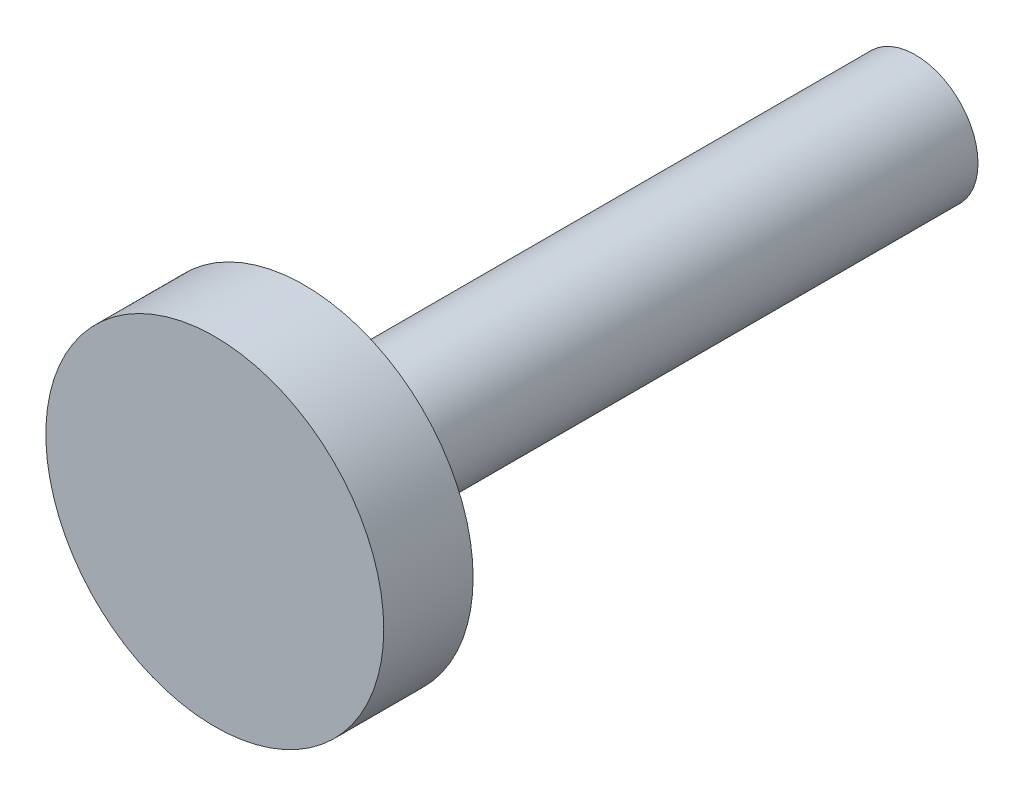
ISO-10303-21;
HEADER;
FILE_DESCRIPTION(('STEP AP214'),'2;1');
FILE_NAME('part.step','',(''),(''),'','','');
FILE_SCHEMA(('AUTOMOTIVE_DESIGN { 1 0 10303 214 1 1 1 1 }'));
ENDSEC;
DATA;
#1=APPLICATION_CONTEXT('core data for automotive mechanical design processes');
#2=APPLICATION_PROTOCOL_DEFINITION('international standard','automotive_design',2000,#1);
#3=PRODUCT_CONTEXT('',#1,'mechanical');
#4=PRODUCT('Part','Part','',(#3));
#5=PRODUCT_RELATED_PRODUCT_CATEGORY('part','',(#4));
#6=PRODUCT_DEFINITION_FORMATION('','',#4);
#7=PRODUCT_DEFINITION_CONTEXT('part definition',#1,'design');
#8=PRODUCT_DEFINITION('design','',#6,#7);
#9=PRODUCT_DEFINITION_SHAPE('','',#8);
#10=(LENGTH_UNIT() NAMED_UNIT(*) SI_UNIT(.MILLI.,.METRE.));
#11=(NAMED_UNIT(*) PLANE_ANGLE_UNIT() SI_UNIT($,.RADIAN.));
#12=(NAMED_UNIT(*) SI_UNIT($,.STERADIAN.) SOLID_ANGLE_UNIT());
#13=UNCERTAINTY_MEASURE_WITH_UNIT(LENGTH_MEASURE(1.E-05),#10,'distance_accuracy_value','');
#14=(GEOMETRIC_REPRESENTATION_CONTEXT(3) GLOBAL_UNCERTAINTY_ASSIGNED_CONTEXT((#13)) GLOBAL_UNIT_ASSIGNED_CONTEXT((#10,
#11,#12)) REPRESENTATION_CONTEXT('',''));
#15=CARTESIAN_POINT('',(0.,0.,0.));
#16=DIRECTION('',(0.,0.,1.));
#17=DIRECTION('',(1.,0.,0.));
#18=AXIS2_PLACEMENT_3D('',#15,#16,#17);
#19=CARTESIAN_POINT('',(0.,0.,34.2));
#20=DIRECTION('',(0.,0.,-1.));
#21=DIRECTION('',(-1.,0.,0.));
#22=AXIS2_PLACEMENT_3D('',#19,#20,#21);
#23=CYLINDRICAL_SURFACE('',#22,3.5);
#24=CARTESIAN_POINT('',(0.,0.,34.2));
#25=DIRECTION('',(0.,0.,1.));
#26=DIRECTION('',(1.,0.,0.));
#27=AXIS2_PLACEMENT_3D('',#24,#25,#26);
#28=CIRCLE('',#27,3.5);
#29=CARTESIAN_POINT('',(3.5,0.,34.2));
#30=VERTEX_POINT('',#29);
#31=EDGE_CURVE('E11',#30,#30,#28,.T.);
#32=ORIENTED_EDGE('',*,*,#31,.F.);
#33=EDGE_LOOP('',(#32));
#34=FACE_BOUND('',#33,.T.);
#35=CARTESIAN_POINT('',(0.,0.,0.));
#36=DIRECTION('',(0.,0.,1.));
#37=DIRECTION('',(1.,0.,0.));
#38=AXIS2_PLACEMENT_3D('',#35,#36,#37);
#39=CIRCLE('',#38,3.5);
#40=CARTESIAN_POINT('',(3.5,0.,0.));
#41=VERTEX_POINT('',#40);
#42=EDGE_CURVE('E36',#41,#41,#39,.T.);
#43=ORIENTED_EDGE('',*,*,#42,.T.);
#44=EDGE_LOOP('',(#43));
#45=FACE_BOUND('',#44,.T.);
#46=ADVANCED_FACE('F33',(#34,#45),#23,.T.);
#47=CARTESIAN_POINT('',(0.,0.,0.));
#48=DIRECTION('',(0.,0.,1.));
#49=DIRECTION('',(1.,0.,0.));
#50=AXIS2_PLACEMENT_3D('',#47,#48,#49);
#51=PLANE('',#50);
#52=DIRECTION('',(0.156092251279794,-0.98774248116116,0.));
#53=VECTOR('',#52,1.);
#54=CARTESIAN_POINT('',(1.94340988860685,1.57262773880696,0.));
#55=LINE('',#54,#53);
#56=CARTESIAN_POINT('',(1.94340988860685,1.57262773880696,0.));
#57=VERTEX_POINT('',#56);
#58=CARTESIAN_POINT('',(2.33364051680634,-0.896728464095936,0.));
#59=VERTEX_POINT('',#58);
#60=EDGE_CURVE('E121',#57,#59,#55,.T.);
#61=ORIENTED_EDGE('',*,*,#60,.F.);
#62=DIRECTION('',(0.933456206722534,-0.358691385638374,0.));
#63=VECTOR('',#62,1.);
#64=CARTESIAN_POINT('',(-0.390230628199486,2.4693562029029,0.));
#65=LINE('',#64,#63);
#66=CARTESIAN_POINT('',(-0.390230628199486,2.4693562029029,0.));
#67=VERTEX_POINT('',#66);
#68=EDGE_CURVE('E47',#67,#57,#65,.T.);
#69=ORIENTED_EDGE('',*,*,#68,.F.);
#70=DIRECTION('',(0.77736395544274,0.629051095522786,0.));
#71=VECTOR('',#70,1.);
#72=CARTESIAN_POINT('',(-2.33364051680634,0.896728464095936,0.));
#73=LINE('',#72,#71);
#74=CARTESIAN_POINT('',(-2.33364051680634,0.896728464095936,0.));
#75=VERTEX_POINT('',#74);
#76=EDGE_CURVE('E131',#75,#67,#73,.T.);
#77=ORIENTED_EDGE('',*,*,#76,.F.);
#78=DIRECTION('',(-0.156092251279794,0.987742481161161,0.));
#79=VECTOR('',#78,1.);
#80=CARTESIAN_POINT('',(-1.94340988860685,-1.57262773880697,0.));
#81=LINE('',#80,#79);
#82=CARTESIAN_POINT('',(-1.94340988860685,-1.57262773880697,0.));
#83=VERTEX_POINT('',#82);
#84=EDGE_CURVE('E129',#83,#75,#81,.T.);
#85=ORIENTED_EDGE('',*,*,#84,.F.);
#86=DIRECTION('',(-0.933456206722534,0.358691385638374,0.));
#87=VECTOR('',#86,1.);
#88=CARTESIAN_POINT('',(0.390230628199484,-2.4693562029029,0.));
#89=LINE('',#88,#87);
#90=CARTESIAN_POINT('',(0.390230628199484,-2.4693562029029,0.));
#91=VERTEX_POINT('',#90);
#92=EDGE_CURVE('E95',#91,#83,#89,.T.);
#93=ORIENTED_EDGE('',*,*,#92,.F.);
#94=DIRECTION('',(-0.77736395544274,-0.629051095522786,0.));
#95=VECTOR('',#94,1.);
#96=CARTESIAN_POINT('',(2.33364051680634,-0.896728464095936,0.));
#97=LINE('',#96,#95);
#98=EDGE_CURVE('E125',#59,#91,#97,.T.);
#99=ORIENTED_EDGE('',*,*,#98,.F.);
#100=EDGE_LOOP('',(#61,#69,#77,#85,#93,#99));
#101=FACE_BOUND('',#100,.T.);
#102=ORIENTED_EDGE('',*,*,#42,.F.);
#103=EDGE_LOOP('',(#102));
#104=FACE_BOUND('',#103,.T.);
#105=ADVANCED_FACE('F165',(#101,#104),#51,.F.);
#106=CARTESIAN_POINT('',(0.,0.,39.2));
#107=DIRECTION('',(0.,0.,-1.));
#108=DIRECTION('',(-1.,0.,0.));
#109=AXIS2_PLACEMENT_3D('',#106,#107,#108);
#110=CYLINDRICAL_SURFACE('',#109,9.45299319);
#111=CARTESIAN_POINT('',(0.,0.,39.2));
#112=DIRECTION('',(0.,0.,1.));
#113=DIRECTION('',(1.,0.,0.));
#114=AXIS2_PLACEMENT_3D('',#111,#112,#113);
#115=CIRCLE('',#114,9.45299319);
#116=CARTESIAN_POINT('',(9.45299319,0.,39.2));
#117=VERTEX_POINT('',#116);
#118=EDGE_CURVE('E141',#117,#117,#115,.T.);
#119=ORIENTED_EDGE('',*,*,#118,.F.);
#120=EDGE_LOOP('',(#119));
#121=FACE_BOUND('',#120,.T.);
#122=CARTESIAN_POINT('',(0.,0.,34.2));
#123=DIRECTION('',(0.,0.,1.));
#124=DIRECTION('',(1.,0.,0.));
#125=AXIS2_PLACEMENT_3D('',#122,#123,#124);
#126=CIRCLE('',#125,9.45299319);
#127=CARTESIAN_POINT('',(9.45299319,0.,34.2));
#128=VERTEX_POINT('',#127);
#129=EDGE_CURVE('E135',#128,#128,#126,.T.);
#130=ORIENTED_EDGE('',*,*,#129,.T.);
#131=EDGE_LOOP('',(#130));
#132=FACE_BOUND('',#131,.T.);
#133=ADVANCED_FACE('F147',(#121,#132),#110,.T.);
#134=CARTESIAN_POINT('',(0.,0.,39.2));
#135=DIRECTION('',(0.,0.,1.));
#136=DIRECTION('',(1.,0.,0.));
#137=AXIS2_PLACEMENT_3D('',#134,#135,#136);
#138=PLANE('',#137);
#139=ORIENTED_EDGE('',*,*,#118,.T.);
#140=EDGE_LOOP('',(#139));
#141=FACE_BOUND('',#140,.T.);
#142=ADVANCED_FACE('F152',(#141),#138,.T.);
#143=CARTESIAN_POINT('',(0.,0.,34.2));
#144=DIRECTION('',(0.,0.,1.));
#145=DIRECTION('',(1.,0.,0.));
#146=AXIS2_PLACEMENT_3D('',#143,#144,#145);
#147=PLANE('',#146);
#148=ORIENTED_EDGE('',*,*,#31,.T.);
#149=EDGE_LOOP('',(#148));
#150=FACE_BOUND('',#149,.T.);
#151=ORIENTED_EDGE('',*,*,#129,.F.);
#152=EDGE_LOOP('',(#151));
#153=FACE_BOUND('',#152,.T.);
#154=ADVANCED_FACE('F149',(#150,#153),#147,.F.);
#155=CARTESIAN_POINT('',(-0.390230628199486,2.4693562029029,1.92));
#156=DIRECTION('',(0.358691385638374,0.933456206722534,0.));
#157=DIRECTION('',(-0.933456206722534,0.358691385638374,0.));
#158=AXIS2_PLACEMENT_3D('',#155,#156,#157);
#159=PLANE('',#158);
#160=ORIENTED_EDGE('',*,*,#68,.T.);
#161=DIRECTION('',(0.,0.,-1.));
#162=VECTOR('',#161,1.);
#163=CARTESIAN_POINT('',(1.94340988860685,1.57262773880696,1.92));
#164=LINE('',#163,#162);
#165=CARTESIAN_POINT('',(1.94340988860685,1.57262773880696,1.92));
#166=VERTEX_POINT('',#165);
#167=EDGE_CURVE('E77',#166,#57,#164,.T.);
#168=ORIENTED_EDGE('',*,*,#167,.F.);
#169=DIRECTION('',(0.933456206722534,-0.358691385638374,0.));
#170=VECTOR('',#169,1.);
#171=CARTESIAN_POINT('',(-0.390230628199486,2.4693562029029,1.92));
#172=LINE('',#171,#170);
#173=CARTESIAN_POINT('',(-0.390230628199486,2.4693562029029,1.92));
#174=VERTEX_POINT('',#173);
#175=EDGE_CURVE('E133',#174,#166,#172,.T.);
#176=ORIENTED_EDGE('',*,*,#175,.F.);
#177=DIRECTION('',(0.,0.,-1.));
#178=VECTOR('',#177,1.);
#179=CARTESIAN_POINT('',(-0.390230628199486,2.4693562029029,1.92));
#180=LINE('',#179,#178);
#181=EDGE_CURVE('E55',#174,#67,#180,.T.);
#182=ORIENTED_EDGE('',*,*,#181,.T.);
#183=EDGE_LOOP('',(#160,#168,#176,#182));
#184=FACE_BOUND('',#183,.T.);
#185=ADVANCED_FACE('F151',(#184),#159,.F.);
#186=CARTESIAN_POINT('',(-2.33364051680634,0.896728464095936,1.92));
#187=DIRECTION('',(-0.629051095522786,0.77736395544274,0.));
#188=DIRECTION('',(-0.77736395544274,-0.629051095522786,0.));
#189=AXIS2_PLACEMENT_3D('',#186,#187,#188);
#190=PLANE('',#189);
#191=ORIENTED_EDGE('',*,*,#76,.T.);
#192=ORIENTED_EDGE('',*,*,#181,.F.);
#193=DIRECTION('',(0.77736395544274,0.629051095522786,0.));
#194=VECTOR('',#193,1.);
#195=CARTESIAN_POINT('',(-2.33364051680634,0.896728464095936,1.92));
#196=LINE('',#195,#194);
#197=CARTESIAN_POINT('',(-2.33364051680634,0.896728464095936,1.92));
#198=VERTEX_POINT('',#197);
#199=EDGE_CURVE('E107',#198,#174,#196,.T.);
#200=ORIENTED_EDGE('',*,*,#199,.F.);
#201=DIRECTION('',(0.,0.,-1.));
#202=VECTOR('',#201,1.);
#203=CARTESIAN_POINT('',(-2.33364051680634,0.896728464095936,1.92));
#204=LINE('',#203,#202);
#205=EDGE_CURVE('E99',#198,#75,#204,.T.);
#206=ORIENTED_EDGE('',*,*,#205,.T.);
#207=EDGE_LOOP('',(#191,#192,#200,#206));
#208=FACE_BOUND('',#207,.T.);
#209=ADVANCED_FACE('F159',(#208),#190,.F.);
#210=CARTESIAN_POINT('',(-1.94340988860685,-1.57262773880697,1.92));
#211=DIRECTION('',(-0.987742481161161,-0.156092251279794,0.));
#212=DIRECTION('',(0.156092251279794,-0.987742481161161,0.));
#213=AXIS2_PLACEMENT_3D('',#210,#211,#212);
#214=PLANE('',#213);
#215=ORIENTED_EDGE('',*,*,#84,.T.);
#216=ORIENTED_EDGE('',*,*,#205,.F.);
#217=DIRECTION('',(-0.156092251279794,0.987742481161161,0.));
#218=VECTOR('',#217,1.);
#219=CARTESIAN_POINT('',(-1.94340988860685,-1.57262773880697,1.92));
#220=LINE('',#219,#218);
#221=CARTESIAN_POINT('',(-1.94340988860685,-1.57262773880697,1.92));
#222=VERTEX_POINT('',#221);
#223=EDGE_CURVE('E103',#222,#198,#220,.T.);
#224=ORIENTED_EDGE('',*,*,#223,.F.);
#225=DIRECTION('',(0.,0.,-1.));
#226=VECTOR('',#225,1.);
#227=CARTESIAN_POINT('',(-1.94340988860685,-1.57262773880697,1.92));
#228=LINE('',#227,#226);
#229=EDGE_CURVE('E88',#222,#83,#228,.T.);
#230=ORIENTED_EDGE('',*,*,#229,.T.);
#231=EDGE_LOOP('',(#215,#216,#224,#230));
#232=FACE_BOUND('',#231,.T.);
#233=ADVANCED_FACE('F104',(#232),#214,.F.);
#234=CARTESIAN_POINT('',(0.390230628199484,-2.4693562029029,1.92));
#235=DIRECTION('',(-0.358691385638374,-0.933456206722534,0.));
#236=DIRECTION('',(0.933456206722535,-0.358691385638374,0.));
#237=AXIS2_PLACEMENT_3D('',#234,#235,#236);
#238=PLANE('',#237);
#239=ORIENTED_EDGE('',*,*,#92,.T.);
#240=ORIENTED_EDGE('',*,*,#229,.F.);
#241=DIRECTION('',(-0.933456206722534,0.358691385638374,0.));
#242=VECTOR('',#241,1.);
#243=CARTESIAN_POINT('',(0.390230628199484,-2.4693562029029,1.92));
#244=LINE('',#243,#242);
#245=CARTESIAN_POINT('',(0.390230628199484,-2.4693562029029,1.92));
#246=VERTEX_POINT('',#245);
#247=EDGE_CURVE('E92',#246,#222,#244,.T.);
#248=ORIENTED_EDGE('',*,*,#247,.F.);
#249=DIRECTION('',(0.,0.,-1.));
#250=VECTOR('',#249,1.);
#251=CARTESIAN_POINT('',(0.390230628199484,-2.4693562029029,1.92));
#252=LINE('',#251,#250);
#253=EDGE_CURVE('E100',#246,#91,#252,.T.);
#254=ORIENTED_EDGE('',*,*,#253,.T.);
#255=EDGE_LOOP('',(#239,#240,#248,#254));
#256=FACE_BOUND('',#255,.T.);
#257=ADVANCED_FACE('F90',(#256),#238,.F.);
#258=CARTESIAN_POINT('',(2.33364051680634,-0.896728464095936,1.92));
#259=DIRECTION('',(0.629051095522786,-0.777363955442741,0.));
#260=DIRECTION('',(0.777363955442741,0.629051095522786,0.));
#261=AXIS2_PLACEMENT_3D('',#258,#259,#260);
#262=PLANE('',#261);
#263=ORIENTED_EDGE('',*,*,#98,.T.);
#264=ORIENTED_EDGE('',*,*,#253,.F.);
#265=DIRECTION('',(-0.77736395544274,-0.629051095522786,0.));
#266=VECTOR('',#265,1.);
#267=CARTESIAN_POINT('',(2.33364051680634,-0.896728464095936,1.92));
#268=LINE('',#267,#266);
#269=CARTESIAN_POINT('',(2.33364051680634,-0.896728464095936,1.92));
#270=VERTEX_POINT('',#269);
#271=EDGE_CURVE('E113',#270,#246,#268,.T.);
#272=ORIENTED_EDGE('',*,*,#271,.F.);
#273=DIRECTION('',(0.,0.,-1.));
#274=VECTOR('',#273,1.);
#275=CARTESIAN_POINT('',(2.33364051680634,-0.896728464095936,1.92));
#276=LINE('',#275,#274);
#277=EDGE_CURVE('E138',#270,#59,#276,.T.);
#278=ORIENTED_EDGE('',*,*,#277,.T.);
#279=EDGE_LOOP('',(#263,#264,#272,#278));
#280=FACE_BOUND('',#279,.T.);
#281=ADVANCED_FACE('F206',(#280),#262,.F.);
#282=CARTESIAN_POINT('',(1.94340988860685,1.57262773880696,1.92));
#283=DIRECTION('',(0.987742481161161,0.156092251279794,0.));
#284=DIRECTION('',(-0.156092251279794,0.987742481161161,0.));
#285=AXIS2_PLACEMENT_3D('',#282,#283,#284);
#286=PLANE('',#285);
#287=ORIENTED_EDGE('',*,*,#60,.T.);
#288=ORIENTED_EDGE('',*,*,#277,.F.);
#289=DIRECTION('',(0.156092251279794,-0.98774248116116,0.));
#290=VECTOR('',#289,1.);
#291=CARTESIAN_POINT('',(1.94340988860685,1.57262773880696,1.92));
#292=LINE('',#291,#290);
#293=EDGE_CURVE('E115',#166,#270,#292,.T.);
#294=ORIENTED_EDGE('',*,*,#293,.F.);
#295=ORIENTED_EDGE('',*,*,#167,.T.);
#296=EDGE_LOOP('',(#287,#288,#294,#295));
#297=FACE_BOUND('',#296,.T.);
#298=ADVANCED_FACE('F184',(#297),#286,.F.);
#299=CARTESIAN_POINT('',(0.,0.,1.92));
#300=DIRECTION('',(0.,0.,-1.));
#301=DIRECTION('',(-1.,0.,0.));
#302=AXIS2_PLACEMENT_3D('',#299,#300,#301);
#303=PLANE('',#302);
#304=CARTESIAN_POINT('',(0.,0.,1.92));
#305=DIRECTION('',(0.,0.,-1.));
#306=DIRECTION('',(-1.,0.,0.));
#307=AXIS2_PLACEMENT_3D('',#304,#305,#306);
#308=CIRCLE('',#307,1.);
#309=CARTESIAN_POINT('',(-1.,0.,1.92));
#310=VERTEX_POINT('',#309);
#311=EDGE_CURVE('E187',#310,#310,#308,.T.);
#312=ORIENTED_EDGE('',*,*,#311,.F.);
#313=EDGE_LOOP('',(#312));
#314=FACE_BOUND('',#313,.T.);
#315=ORIENTED_EDGE('',*,*,#175,.T.);
#316=ORIENTED_EDGE('',*,*,#293,.T.);
#317=ORIENTED_EDGE('',*,*,#271,.T.);
#318=ORIENTED_EDGE('',*,*,#247,.T.);
#319=ORIENTED_EDGE('',*,*,#223,.T.);
#320=ORIENTED_EDGE('',*,*,#199,.T.);
#321=EDGE_LOOP('',(#315,#316,#317,#318,#319,#320));
#322=FACE_BOUND('',#321,.T.);
#323=ADVANCED_FACE('F110',(#314,#322),#303,.T.);
#324=CARTESIAN_POINT('',(0.,0.,11.92));
#325=DIRECTION('',(0.,0.,-1.));
#326=DIRECTION('',(-1.,0.,0.));
#327=AXIS2_PLACEMENT_3D('',#324,#325,#326);
#328=CYLINDRICAL_SURFACE('',#327,1.);
#329=CARTESIAN_POINT('',(0.,0.,11.92));
#330=DIRECTION('',(0.,0.,-1.));
#331=DIRECTION('',(-1.,0.,0.));
#332=AXIS2_PLACEMENT_3D('',#329,#330,#331);
#333=CIRCLE('',#332,1.);
#334=CARTESIAN_POINT('',(-1.,0.,11.92));
#335=VERTEX_POINT('',#334);
#336=EDGE_CURVE('E122',#335,#335,#333,.T.);
#337=ORIENTED_EDGE('',*,*,#336,.F.);
#338=EDGE_LOOP('',(#337));
#339=FACE_BOUND('',#338,.T.);
#340=ORIENTED_EDGE('',*,*,#311,.T.);
#341=EDGE_LOOP('',(#340));
#342=FACE_BOUND('',#341,.T.);
#343=ADVANCED_FACE('F195',(#339,#342),#328,.F.);
#344=CARTESIAN_POINT('',(0.,0.,11.92));
#345=DIRECTION('',(0.,0.,-1.));
#346=DIRECTION('',(-1.,0.,0.));
#347=AXIS2_PLACEMENT_3D('',#344,#345,#346);
#348=PLANE('',#347);
#349=ORIENTED_EDGE('',*,*,#336,.T.);
#350=EDGE_LOOP('',(#349));
#351=FACE_BOUND('',#350,.T.);
#352=ADVANCED_FACE('F193',(#351),#348,.T.);
#353=CLOSED_SHELL('',(#46,#105,#133,#142,#154,#185,#209,#233,#257,#281,#298,#323,#343,#352));
#354=MANIFOLD_SOLID_BREP('B2',#353);
#355=ADVANCED_BREP_SHAPE_REPRESENTATION('',(#18,#354),#14);
#356=SHAPE_DEFINITION_REPRESENTATION(#9,#355);
ENDSEC;
END-ISO-10303-21;
